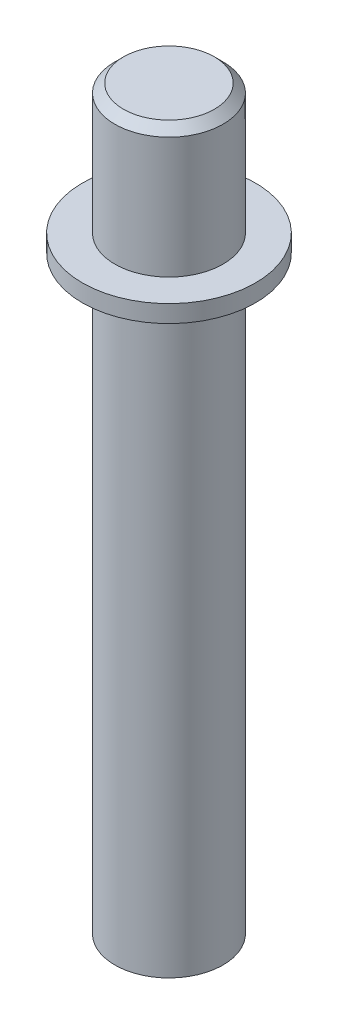
ISO-10303-21;
HEADER;
FILE_DESCRIPTION(('STEP AP214'),'2;1');
FILE_NAME('part.step','',(''),(''),'','','');
FILE_SCHEMA(('AUTOMOTIVE_DESIGN { 1 0 10303 214 1 1 1 1 }'));
ENDSEC;
DATA;
#1=APPLICATION_CONTEXT('core data for automotive mechanical design processes');
#2=APPLICATION_PROTOCOL_DEFINITION('international standard','automotive_design',2000,#1);
#3=PRODUCT_CONTEXT('',#1,'mechanical');
#4=PRODUCT('Part','Part','',(#3));
#5=PRODUCT_RELATED_PRODUCT_CATEGORY('part','',(#4));
#6=PRODUCT_DEFINITION_FORMATION('','',#4);
#7=PRODUCT_DEFINITION_CONTEXT('part definition',#1,'design');
#8=PRODUCT_DEFINITION('design','',#6,#7);
#9=PRODUCT_DEFINITION_SHAPE('','',#8);
#10=(LENGTH_UNIT() NAMED_UNIT(*) SI_UNIT(.MILLI.,.METRE.));
#11=(NAMED_UNIT(*) PLANE_ANGLE_UNIT() SI_UNIT($,.RADIAN.));
#12=(NAMED_UNIT(*) SI_UNIT($,.STERADIAN.) SOLID_ANGLE_UNIT());
#13=UNCERTAINTY_MEASURE_WITH_UNIT(LENGTH_MEASURE(1.E-05),#10,'distance_accuracy_value','');
#14=(GEOMETRIC_REPRESENTATION_CONTEXT(3) GLOBAL_UNCERTAINTY_ASSIGNED_CONTEXT((#13)) GLOBAL_UNIT_ASSIGNED_CONTEXT((#10,
#11,#12)) REPRESENTATION_CONTEXT('',''));
#15=CARTESIAN_POINT('',(0.,0.,0.));
#16=DIRECTION('',(0.,0.,1.));
#17=DIRECTION('',(1.,0.,0.));
#18=AXIS2_PLACEMENT_3D('',#15,#16,#17);
#19=CARTESIAN_POINT('',(0.,14.2875,0.));
#20=DIRECTION('',(0.,-1.,0.));
#21=DIRECTION('',(0.,0.,-1.));
#22=AXIS2_PLACEMENT_3D('',#19,#20,#21);
#23=CYLINDRICAL_SURFACE('',#22,3.175);
#24=CARTESIAN_POINT('',(0.,14.2875,0.));
#25=DIRECTION('',(0.,1.,0.));
#26=DIRECTION('',(0.,0.,1.));
#27=AXIS2_PLACEMENT_3D('',#24,#25,#26);
#28=CIRCLE('',#27,3.175);
#29=CARTESIAN_POINT('',(0.,14.2875,3.175));
#30=VERTEX_POINT('',#29);
#31=EDGE_CURVE('E63',#30,#30,#28,.T.);
#32=ORIENTED_EDGE('',*,*,#31,.F.);
#33=EDGE_LOOP('',(#32));
#34=FACE_BOUND('',#33,.T.);
#35=CARTESIAN_POINT('',(0.,-20.32,0.));
#36=DIRECTION('',(0.,-1.,0.));
#37=DIRECTION('',(0.,0.,-1.));
#38=AXIS2_PLACEMENT_3D('',#35,#36,#37);
#39=CIRCLE('',#38,3.175);
#40=CARTESIAN_POINT('',(0.,-20.32,-3.175));
#41=VERTEX_POINT('',#40);
#42=EDGE_CURVE('E73',#41,#41,#39,.T.);
#43=ORIENTED_EDGE('',*,*,#42,.F.);
#44=EDGE_LOOP('',(#43));
#45=FACE_BOUND('',#44,.T.);
#46=ADVANCED_FACE('F44',(#34,#45),#23,.T.);
#47=CARTESIAN_POINT('',(0.,15.3035,0.));
#48=DIRECTION('',(0.,-1.,0.));
#49=DIRECTION('',(0.,0.,-1.));
#50=AXIS2_PLACEMENT_3D('',#47,#48,#49);
#51=CYLINDRICAL_SURFACE('',#50,5.08);
#52=CARTESIAN_POINT('',(0.,15.3035,0.));
#53=DIRECTION('',(0.,1.,0.));
#54=DIRECTION('',(0.,0.,1.));
#55=AXIS2_PLACEMENT_3D('',#52,#53,#54);
#56=CIRCLE('',#55,5.08);
#57=CARTESIAN_POINT('',(0.,15.3035,5.08));
#58=VERTEX_POINT('',#57);
#59=EDGE_CURVE('E70',#58,#58,#56,.T.);
#60=ORIENTED_EDGE('',*,*,#59,.F.);
#61=EDGE_LOOP('',(#60));
#62=FACE_BOUND('',#61,.T.);
#63=CARTESIAN_POINT('',(0.,14.2875,0.));
#64=DIRECTION('',(0.,1.,0.));
#65=DIRECTION('',(0.,0.,1.));
#66=AXIS2_PLACEMENT_3D('',#63,#64,#65);
#67=CIRCLE('',#66,5.08);
#68=CARTESIAN_POINT('',(0.,14.2875,5.08));
#69=VERTEX_POINT('',#68);
#70=EDGE_CURVE('E72',#69,#69,#67,.T.);
#71=ORIENTED_EDGE('',*,*,#70,.T.);
#72=EDGE_LOOP('',(#71));
#73=FACE_BOUND('',#72,.T.);
#74=ADVANCED_FACE('F88',(#62,#73),#51,.T.);
#75=CARTESIAN_POINT('',(0.,15.3035,0.));
#76=DIRECTION('',(0.,1.,0.));
#77=DIRECTION('',(0.,0.,1.));
#78=AXIS2_PLACEMENT_3D('',#75,#76,#77);
#79=PLANE('',#78);
#80=CARTESIAN_POINT('',(0.,15.3035,0.));
#81=DIRECTION('',(0.,1.,0.));
#82=DIRECTION('',(0.,0.,1.));
#83=AXIS2_PLACEMENT_3D('',#80,#81,#82);
#84=CIRCLE('',#83,3.17500000000001);
#85=CARTESIAN_POINT('',(0.,15.3035,-3.17500000000001));
#86=VERTEX_POINT('',#85);
#87=EDGE_CURVE('E56',#86,#86,#84,.T.);
#88=ORIENTED_EDGE('',*,*,#87,.F.);
#89=EDGE_LOOP('',(#88));
#90=FACE_BOUND('',#89,.T.);
#91=ORIENTED_EDGE('',*,*,#59,.T.);
#92=EDGE_LOOP('',(#91));
#93=FACE_BOUND('',#92,.T.);
#94=ADVANCED_FACE('F91',(#90,#93),#79,.T.);
#95=CARTESIAN_POINT('',(0.,14.2875,0.));
#96=DIRECTION('',(0.,1.,0.));
#97=DIRECTION('',(0.,0.,1.));
#98=AXIS2_PLACEMENT_3D('',#95,#96,#97);
#99=PLANE('',#98);
#100=ORIENTED_EDGE('',*,*,#31,.T.);
#101=EDGE_LOOP('',(#100));
#102=FACE_BOUND('',#101,.T.);
#103=ORIENTED_EDGE('',*,*,#70,.F.);
#104=EDGE_LOOP('',(#103));
#105=FACE_BOUND('',#104,.T.);
#106=ADVANCED_FACE('F98',(#102,#105),#99,.F.);
#107=CARTESIAN_POINT('',(0.,22.9235,0.));
#108=DIRECTION('',(0.,-1.,0.));
#109=DIRECTION('',(0.,0.,-1.));
#110=AXIS2_PLACEMENT_3D('',#107,#108,#109);
#111=CYLINDRICAL_SURFACE('',#110,3.17500000000001);
#112=CARTESIAN_POINT('',(0.,22.4155,0.));
#113=DIRECTION('',(0.,1.,0.));
#114=DIRECTION('',(0.,0.,1.));
#115=AXIS2_PLACEMENT_3D('',#112,#113,#114);
#116=CIRCLE('',#115,3.17500000000001);
#117=CARTESIAN_POINT('',(0.,22.4155,-3.17500000000001));
#118=VERTEX_POINT('',#117);
#119=EDGE_CURVE('E10',#118,#118,#116,.F.);
#120=CARTESIAN_POINT('',(0.,22.4155,-3.17500000000001));
#121=CARTESIAN_POINT('',(0.,22.3414166666667,-3.17500000000001));
#122=CARTESIAN_POINT('',(0.,22.2673333333333,-3.17500000000001));
#123=CARTESIAN_POINT('',(0.,22.1191666666667,-3.17500000000001));
#124=CARTESIAN_POINT('',(0.,22.0450833333333,-3.17500000000001));
#125=CARTESIAN_POINT('',(0.,21.8969166666667,-3.17500000000001));
#126=CARTESIAN_POINT('',(0.,21.8228333333333,-3.17500000000001));
#127=CARTESIAN_POINT('',(0.,21.6746666666667,-3.17500000000001));
#128=CARTESIAN_POINT('',(0.,21.6005833333333,-3.17500000000001));
#129=CARTESIAN_POINT('',(0.,21.4524166666667,-3.17500000000001));
#130=CARTESIAN_POINT('',(0.,21.3783333333333,-3.17500000000001));
#131=CARTESIAN_POINT('',(0.,21.2301666666667,-3.17500000000001));
#132=CARTESIAN_POINT('',(0.,21.1560833333333,-3.17500000000001));
#133=CARTESIAN_POINT('',(0.,21.0079166666667,-3.17500000000001));
#134=CARTESIAN_POINT('',(0.,20.9338333333333,-3.17500000000001));
#135=CARTESIAN_POINT('',(0.,20.7856666666667,-3.17500000000001));
#136=CARTESIAN_POINT('',(0.,20.7115833333333,-3.17500000000001));
#137=CARTESIAN_POINT('',(0.,20.5634166666667,-3.17500000000001));
#138=CARTESIAN_POINT('',(0.,20.4893333333333,-3.17500000000001));
#139=CARTESIAN_POINT('',(0.,20.3411666666667,-3.17500000000001));
#140=CARTESIAN_POINT('',(0.,20.2670833333333,-3.17500000000001));
#141=CARTESIAN_POINT('',(0.,20.1189166666667,-3.17500000000001));
#142=CARTESIAN_POINT('',(0.,20.0448333333333,-3.17500000000001));
#143=CARTESIAN_POINT('',(0.,19.8966666666667,-3.17500000000001));
#144=CARTESIAN_POINT('',(0.,19.8225833333333,-3.17500000000001));
#145=CARTESIAN_POINT('',(0.,19.6744166666667,-3.17500000000001));
#146=CARTESIAN_POINT('',(0.,19.6003333333333,-3.17500000000001));
#147=CARTESIAN_POINT('',(0.,19.4521666666667,-3.17500000000001));
#148=CARTESIAN_POINT('',(0.,19.3780833333333,-3.17500000000001));
#149=CARTESIAN_POINT('',(0.,19.2299166666667,-3.17500000000001));
#150=CARTESIAN_POINT('',(0.,19.1558333333333,-3.17500000000001));
#151=CARTESIAN_POINT('',(0.,19.0076666666667,-3.17500000000001));
#152=CARTESIAN_POINT('',(0.,18.9335833333333,-3.17500000000001));
#153=CARTESIAN_POINT('',(0.,18.7854166666667,-3.17500000000001));
#154=CARTESIAN_POINT('',(0.,18.7113333333333,-3.17500000000001));
#155=CARTESIAN_POINT('',(0.,18.5631666666667,-3.17500000000001));
#156=CARTESIAN_POINT('',(0.,18.4890833333333,-3.17500000000001));
#157=CARTESIAN_POINT('',(0.,18.3409166666667,-3.17500000000001));
#158=CARTESIAN_POINT('',(0.,18.2668333333333,-3.17500000000001));
#159=CARTESIAN_POINT('',(0.,18.1186666666667,-3.17500000000001));
#160=CARTESIAN_POINT('',(0.,18.0445833333333,-3.17500000000001));
#161=CARTESIAN_POINT('',(0.,17.8964166666667,-3.17500000000001));
#162=CARTESIAN_POINT('',(0.,17.8223333333333,-3.17500000000001));
#163=CARTESIAN_POINT('',(0.,17.6741666666667,-3.17500000000001));
#164=CARTESIAN_POINT('',(0.,17.6000833333333,-3.17500000000001));
#165=CARTESIAN_POINT('',(0.,17.4519166666667,-3.17500000000001));
#166=CARTESIAN_POINT('',(0.,17.3778333333333,-3.17500000000001));
#167=CARTESIAN_POINT('',(0.,17.2296666666667,-3.17500000000001));
#168=CARTESIAN_POINT('',(0.,17.1555833333333,-3.17500000000001));
#169=CARTESIAN_POINT('',(0.,17.0074166666667,-3.17500000000001));
#170=CARTESIAN_POINT('',(0.,16.9333333333333,-3.17500000000001));
#171=CARTESIAN_POINT('',(0.,16.7851666666667,-3.17500000000001));
#172=CARTESIAN_POINT('',(0.,16.7110833333333,-3.17500000000001));
#173=CARTESIAN_POINT('',(0.,16.5629166666667,-3.17500000000001));
#174=CARTESIAN_POINT('',(0.,16.4888333333333,-3.17500000000001));
#175=CARTESIAN_POINT('',(0.,16.3406666666667,-3.17500000000001));
#176=CARTESIAN_POINT('',(0.,16.2665833333333,-3.17500000000001));
#177=CARTESIAN_POINT('',(0.,16.1184166666667,-3.17500000000001));
#178=CARTESIAN_POINT('',(0.,16.0443333333333,-3.17500000000001));
#179=CARTESIAN_POINT('',(0.,15.8961666666667,-3.17500000000001));
#180=CARTESIAN_POINT('',(0.,15.8220833333333,-3.17500000000001));
#181=CARTESIAN_POINT('',(0.,15.6739166666667,-3.17500000000001));
#182=CARTESIAN_POINT('',(0.,15.5998333333333,-3.17500000000001));
#183=CARTESIAN_POINT('',(0.,15.4516666666667,-3.17500000000001));
#184=CARTESIAN_POINT('',(0.,15.3775833333333,-3.17500000000001));
#185=CARTESIAN_POINT('',(0.,15.3035,-3.17500000000001));
#186=B_SPLINE_CURVE_WITH_KNOTS('',3,(#120,#121,#122,#123,#124,#125,#126,#127,#128,#129,#130,
#131,#132,#133,#134,#135,#136,#137,#138,#139,#140,#141,#142,#143,#144,#145,#146,#147,#148,#149,
#150,#151,#152,#153,#154,#155,#156,#157,#158,#159,#160,#161,#162,#163,#164,#165,#166,#167,#168,
#169,#170,#171,#172,#173,#174,#175,#176,#177,#178,#179,#180,#181,#182,#183,#184,#185),
.UNSPECIFIED.,.F.,.F.,(4,2,2,2,2,2,2,2,2,2,2,2,2,2,2,2,2,2,2,2,2,2,2,2,2,2,2,2,2,2,2,2,4),(0.,
0.22225,0.4445,0.666750000000001,0.889000000000001,1.11125,1.3335,1.55575,1.778,2.00025,2.2225,
2.44475,2.667,2.88925,3.1115,3.33375,3.556,3.77825,4.0005,4.22275,4.445,4.66725,
4.88950000000001,5.11175000000001,5.334,5.55625000000001,5.77850000000001,6.00075000000001,
6.22300000000001,6.44525000000001,6.66750000000001,6.88975000000001,7.11200000000001),.UNSPECIFIED.);
#187=EDGE_CURVE('BSEAM101',#118,#86,#186,.T.);
#188=ORIENTED_EDGE('',*,*,#119,.T.);
#189=ORIENTED_EDGE('',*,*,#87,.T.);
#190=ORIENTED_EDGE('',*,*,#187,.T.);
#191=ORIENTED_EDGE('',*,*,#187,.F.);
#192=EDGE_LOOP('',(#188,#190,#189,#191));
#193=FACE_BOUND('',#192,.T.);
#194=ADVANCED_FACE('F101',(#193),#111,.T.);
#195=CARTESIAN_POINT('',(0.,22.9235,0.));
#196=DIRECTION('',(0.,1.,0.));
#197=DIRECTION('',(0.,0.,1.));
#198=AXIS2_PLACEMENT_3D('',#195,#196,#197);
#199=PLANE('',#198);
#200=CARTESIAN_POINT('',(0.,22.9235,0.));
#201=DIRECTION('',(0.,1.,0.));
#202=DIRECTION('',(0.,0.,1.));
#203=AXIS2_PLACEMENT_3D('',#200,#201,#202);
#204=CIRCLE('',#203,2.66700000000002);
#205=CARTESIAN_POINT('',(0.,22.9235,2.66700000000002));
#206=VERTEX_POINT('',#205);
#207=EDGE_CURVE('E53',#206,#206,#204,.T.);
#208=ORIENTED_EDGE('',*,*,#207,.T.);
#209=EDGE_LOOP('',(#208));
#210=FACE_BOUND('',#209,.T.);
#211=ADVANCED_FACE('F107',(#210),#199,.T.);
#212=CARTESIAN_POINT('',(0.,22.9235,0.));
#213=DIRECTION('',(0.,-1.,0.));
#214=DIRECTION('',(0.,0.,-1.));
#215=AXIS2_PLACEMENT_3D('',#212,#213,#214);
#216=CONICAL_SURFACE('',#215,2.66700000000002,0.785398163397449);
#217=ORIENTED_EDGE('',*,*,#119,.F.);
#218=EDGE_LOOP('',(#217));
#219=FACE_BOUND('',#218,.T.);
#220=ORIENTED_EDGE('',*,*,#207,.F.);
#221=EDGE_LOOP('',(#220));
#222=FACE_BOUND('',#221,.T.);
#223=ADVANCED_FACE('F48',(#219,#222),#216,.T.);
#224=CARTESIAN_POINT('',(0.,-20.32,0.));
#225=DIRECTION('',(0.,-1.,0.));
#226=DIRECTION('',(0.,0.,-1.));
#227=AXIS2_PLACEMENT_3D('',#224,#225,#226);
#228=PLANE('',#227);
#229=ORIENTED_EDGE('',*,*,#42,.T.);
#230=EDGE_LOOP('',(#229));
#231=FACE_BOUND('',#230,.T.);
#232=ADVANCED_FACE('F84',(#231),#228,.T.);
#233=CLOSED_SHELL('',(#46,#74,#94,#106,#194,#211,#223,#232));
#234=MANIFOLD_SOLID_BREP('B2',#233);
#235=ADVANCED_BREP_SHAPE_REPRESENTATION('',(#18,#234),#14);
#236=SHAPE_DEFINITION_REPRESENTATION(#9,#235);
ENDSEC;
END-ISO-10303-21;
